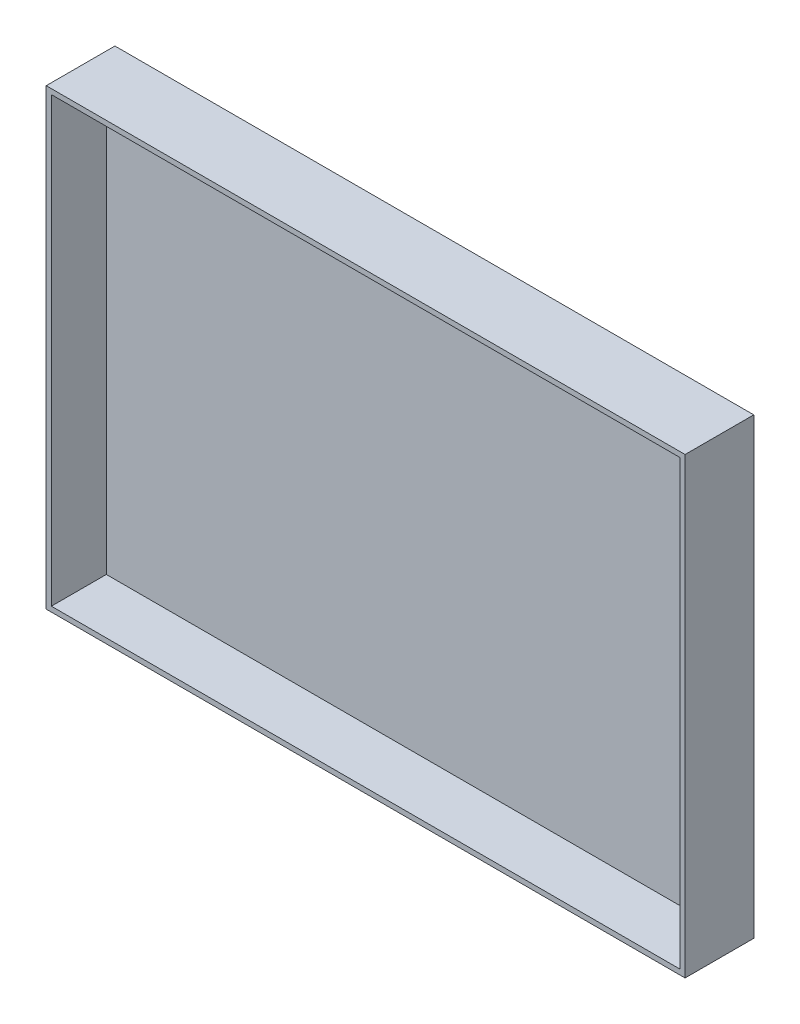
ISO-10303-21;
HEADER;
FILE_DESCRIPTION(('STEP AP214'),'2;1');
FILE_NAME('part.step','',(''),(''),'','','');
FILE_SCHEMA(('AUTOMOTIVE_DESIGN { 1 0 10303 214 1 1 1 1 }'));
ENDSEC;
DATA;
#1=APPLICATION_CONTEXT('core data for automotive mechanical design processes');
#2=APPLICATION_PROTOCOL_DEFINITION('international standard','automotive_design',2000,#1);
#3=PRODUCT_CONTEXT('',#1,'mechanical');
#4=PRODUCT('Part','Part','',(#3));
#5=PRODUCT_RELATED_PRODUCT_CATEGORY('part','',(#4));
#6=PRODUCT_DEFINITION_FORMATION('','',#4);
#7=PRODUCT_DEFINITION_CONTEXT('part definition',#1,'design');
#8=PRODUCT_DEFINITION('design','',#6,#7);
#9=PRODUCT_DEFINITION_SHAPE('','',#8);
#10=(LENGTH_UNIT() NAMED_UNIT(*) SI_UNIT(.MILLI.,.METRE.));
#11=(NAMED_UNIT(*) PLANE_ANGLE_UNIT() SI_UNIT($,.RADIAN.));
#12=(NAMED_UNIT(*) SI_UNIT($,.STERADIAN.) SOLID_ANGLE_UNIT());
#13=UNCERTAINTY_MEASURE_WITH_UNIT(LENGTH_MEASURE(1.E-05),#10,'distance_accuracy_value','');
#14=(GEOMETRIC_REPRESENTATION_CONTEXT(3) GLOBAL_UNCERTAINTY_ASSIGNED_CONTEXT((#13)) GLOBAL_UNIT_ASSIGNED_CONTEXT((#10,
#11,#12)) REPRESENTATION_CONTEXT('',''));
#15=CARTESIAN_POINT('',(0.,0.,0.));
#16=DIRECTION('',(0.,0.,1.));
#17=DIRECTION('',(1.,0.,0.));
#18=AXIS2_PLACEMENT_3D('',#15,#16,#17);
#19=CARTESIAN_POINT('',(45.75,-32.25,10.));
#20=DIRECTION('',(-1.,0.,0.));
#21=DIRECTION('',(0.,0.,1.));
#22=AXIS2_PLACEMENT_3D('',#19,#20,#21);
#23=PLANE('',#22);
#24=DIRECTION('',(0.,0.,-1.));
#25=VECTOR('',#24,1.);
#26=CARTESIAN_POINT('',(45.75,32.25,10.));
#27=LINE('',#26,#25);
#28=CARTESIAN_POINT('',(45.75,32.25,10.));
#29=VERTEX_POINT('',#28);
#30=CARTESIAN_POINT('',(45.75,32.25,2.));
#31=VERTEX_POINT('',#30);
#32=EDGE_CURVE('E112',#29,#31,#27,.T.);
#33=ORIENTED_EDGE('',*,*,#32,.T.);
#34=DIRECTION('',(0.,-1.,0.));
#35=VECTOR('',#34,1.);
#36=CARTESIAN_POINT('',(45.75,-32.25,2.));
#37=LINE('',#36,#35);
#38=CARTESIAN_POINT('',(45.75,-32.25,2.));
#39=VERTEX_POINT('',#38);
#40=EDGE_CURVE('E103',#31,#39,#37,.T.);
#41=ORIENTED_EDGE('',*,*,#40,.T.);
#42=DIRECTION('',(0.,0.,-1.));
#43=VECTOR('',#42,1.);
#44=CARTESIAN_POINT('',(45.75,-32.25,10.));
#45=LINE('',#44,#43);
#46=CARTESIAN_POINT('',(45.75,-32.25,10.));
#47=VERTEX_POINT('',#46);
#48=EDGE_CURVE('E109',#47,#39,#45,.T.);
#49=ORIENTED_EDGE('',*,*,#48,.F.);
#50=DIRECTION('',(0.,1.,0.));
#51=VECTOR('',#50,1.);
#52=CARTESIAN_POINT('',(45.75,-32.25,10.));
#53=LINE('',#52,#51);
#54=EDGE_CURVE('E114',#47,#29,#53,.T.);
#55=ORIENTED_EDGE('',*,*,#54,.T.);
#56=EDGE_LOOP('',(#33,#41,#49,#55));
#57=FACE_BOUND('',#56,.T.);
#58=ADVANCED_FACE('F39',(#57),#23,.T.);
#59=CARTESIAN_POINT('',(-45.75,32.25,10.));
#60=DIRECTION('',(0.,-1.,0.));
#61=DIRECTION('',(0.,0.,-1.));
#62=AXIS2_PLACEMENT_3D('',#59,#60,#61);
#63=PLANE('',#62);
#64=DIRECTION('',(0.,0.,-1.));
#65=VECTOR('',#64,1.);
#66=CARTESIAN_POINT('',(-45.75,32.25,10.));
#67=LINE('',#66,#65);
#68=CARTESIAN_POINT('',(-45.75,32.25,10.));
#69=VERTEX_POINT('',#68);
#70=CARTESIAN_POINT('',(-45.75,32.25,2.));
#71=VERTEX_POINT('',#70);
#72=EDGE_CURVE('E124',#69,#71,#67,.T.);
#73=ORIENTED_EDGE('',*,*,#72,.T.);
#74=DIRECTION('',(1.,0.,0.));
#75=VECTOR('',#74,1.);
#76=CARTESIAN_POINT('',(-45.75,32.25,2.));
#77=LINE('',#76,#75);
#78=EDGE_CURVE('E115',#71,#31,#77,.T.);
#79=ORIENTED_EDGE('',*,*,#78,.T.);
#80=ORIENTED_EDGE('',*,*,#32,.F.);
#81=DIRECTION('',(-1.,0.,0.));
#82=VECTOR('',#81,1.);
#83=CARTESIAN_POINT('',(-45.75,32.25,10.));
#84=LINE('',#83,#82);
#85=EDGE_CURVE('E200',#29,#69,#84,.T.);
#86=ORIENTED_EDGE('',*,*,#85,.T.);
#87=EDGE_LOOP('',(#73,#79,#80,#86));
#88=FACE_BOUND('',#87,.T.);
#89=ADVANCED_FACE('F214',(#88),#63,.T.);
#90=CARTESIAN_POINT('',(-45.75,-32.25,10.));
#91=DIRECTION('',(1.,0.,0.));
#92=DIRECTION('',(0.,0.,-1.));
#93=AXIS2_PLACEMENT_3D('',#90,#91,#92);
#94=PLANE('',#93);
#95=DIRECTION('',(0.,0.,-1.));
#96=VECTOR('',#95,1.);
#97=CARTESIAN_POINT('',(-45.75,-32.25,10.));
#98=LINE('',#97,#96);
#99=CARTESIAN_POINT('',(-45.75,-32.25,10.));
#100=VERTEX_POINT('',#99);
#101=CARTESIAN_POINT('',(-45.75,-32.25,2.));
#102=VERTEX_POINT('',#101);
#103=EDGE_CURVE('E61',#100,#102,#98,.T.);
#104=ORIENTED_EDGE('',*,*,#103,.T.);
#105=DIRECTION('',(0.,1.,0.));
#106=VECTOR('',#105,1.);
#107=CARTESIAN_POINT('',(-45.75,-32.25,2.));
#108=LINE('',#107,#106);
#109=EDGE_CURVE('E55',#102,#71,#108,.T.);
#110=ORIENTED_EDGE('',*,*,#109,.T.);
#111=ORIENTED_EDGE('',*,*,#72,.F.);
#112=DIRECTION('',(0.,-1.,0.));
#113=VECTOR('',#112,1.);
#114=CARTESIAN_POINT('',(-45.75,-32.25,10.));
#115=LINE('',#114,#113);
#116=EDGE_CURVE('E126',#69,#100,#115,.T.);
#117=ORIENTED_EDGE('',*,*,#116,.T.);
#118=EDGE_LOOP('',(#104,#110,#111,#117));
#119=FACE_BOUND('',#118,.T.);
#120=ADVANCED_FACE('F213',(#119),#94,.T.);
#121=CARTESIAN_POINT('',(-45.75,-32.25,10.));
#122=DIRECTION('',(0.,1.,0.));
#123=DIRECTION('',(0.,0.,1.));
#124=AXIS2_PLACEMENT_3D('',#121,#122,#123);
#125=PLANE('',#124);
#126=ORIENTED_EDGE('',*,*,#48,.T.);
#127=DIRECTION('',(-1.,0.,0.));
#128=VECTOR('',#127,1.);
#129=CARTESIAN_POINT('',(-45.75,-32.25,2.));
#130=LINE('',#129,#128);
#131=EDGE_CURVE('E11',#39,#102,#130,.T.);
#132=ORIENTED_EDGE('',*,*,#131,.T.);
#133=ORIENTED_EDGE('',*,*,#103,.F.);
#134=DIRECTION('',(1.,0.,0.));
#135=VECTOR('',#134,1.);
#136=CARTESIAN_POINT('',(-45.75,-32.25,10.));
#137=LINE('',#136,#135);
#138=EDGE_CURVE('E119',#100,#47,#137,.T.);
#139=ORIENTED_EDGE('',*,*,#138,.T.);
#140=EDGE_LOOP('',(#126,#132,#133,#139));
#141=FACE_BOUND('',#140,.T.);
#142=ADVANCED_FACE('F117',(#141),#125,.T.);
#143=CARTESIAN_POINT('',(0.,0.,10.));
#144=DIRECTION('',(0.,0.,1.));
#145=DIRECTION('',(1.,0.,0.));
#146=AXIS2_PLACEMENT_3D('',#143,#144,#145);
#147=PLANE('',#146);
#148=DIRECTION('',(0.,-1.,0.));
#149=VECTOR('',#148,1.);
#150=CARTESIAN_POINT('',(-46.5,-33.,10.));
#151=LINE('',#150,#149);
#152=CARTESIAN_POINT('',(-46.5,33.,10.));
#153=VERTEX_POINT('',#152);
#154=CARTESIAN_POINT('',(-46.5,-33.,10.));
#155=VERTEX_POINT('',#154);
#156=EDGE_CURVE('E136',#153,#155,#151,.T.);
#157=ORIENTED_EDGE('',*,*,#156,.T.);
#158=DIRECTION('',(1.,0.,0.));
#159=VECTOR('',#158,1.);
#160=CARTESIAN_POINT('',(46.5,-33.,10.));
#161=LINE('',#160,#159);
#162=CARTESIAN_POINT('',(46.5,-33.,10.));
#163=VERTEX_POINT('',#162);
#164=EDGE_CURVE('E140',#155,#163,#161,.T.);
#165=ORIENTED_EDGE('',*,*,#164,.T.);
#166=DIRECTION('',(0.,1.,0.));
#167=VECTOR('',#166,1.);
#168=CARTESIAN_POINT('',(46.5,-33.,10.));
#169=LINE('',#168,#167);
#170=CARTESIAN_POINT('',(46.5,33.,10.));
#171=VERTEX_POINT('',#170);
#172=EDGE_CURVE('E144',#163,#171,#169,.T.);
#173=ORIENTED_EDGE('',*,*,#172,.T.);
#174=DIRECTION('',(-1.,0.,0.));
#175=VECTOR('',#174,1.);
#176=CARTESIAN_POINT('',(46.5,33.,10.));
#177=LINE('',#176,#175);
#178=EDGE_CURVE('E147',#171,#153,#177,.T.);
#179=ORIENTED_EDGE('',*,*,#178,.T.);
#180=EDGE_LOOP('',(#157,#165,#173,#179));
#181=FACE_BOUND('',#180,.T.);
#182=ORIENTED_EDGE('',*,*,#85,.F.);
#183=ORIENTED_EDGE('',*,*,#54,.F.);
#184=ORIENTED_EDGE('',*,*,#138,.F.);
#185=ORIENTED_EDGE('',*,*,#116,.F.);
#186=EDGE_LOOP('',(#182,#183,#184,#185));
#187=FACE_BOUND('',#186,.T.);
#188=ADVANCED_FACE('F194',(#181,#187),#147,.T.);
#189=CARTESIAN_POINT('',(0.,0.,0.));
#190=DIRECTION('',(0.,0.,1.));
#191=DIRECTION('',(1.,0.,0.));
#192=AXIS2_PLACEMENT_3D('',#189,#190,#191);
#193=PLANE('',#192);
#194=DIRECTION('',(0.,-1.,0.));
#195=VECTOR('',#194,1.);
#196=CARTESIAN_POINT('',(-46.5,-33.,0.));
#197=LINE('',#196,#195);
#198=CARTESIAN_POINT('',(-46.5,33.,0.));
#199=VERTEX_POINT('',#198);
#200=CARTESIAN_POINT('',(-46.5,-33.,0.));
#201=VERTEX_POINT('',#200);
#202=EDGE_CURVE('E135',#199,#201,#197,.T.);
#203=ORIENTED_EDGE('',*,*,#202,.F.);
#204=DIRECTION('',(-1.,0.,0.));
#205=VECTOR('',#204,1.);
#206=CARTESIAN_POINT('',(46.5,33.,0.));
#207=LINE('',#206,#205);
#208=CARTESIAN_POINT('',(46.5,33.,0.));
#209=VERTEX_POINT('',#208);
#210=EDGE_CURVE('E141',#209,#199,#207,.T.);
#211=ORIENTED_EDGE('',*,*,#210,.F.);
#212=DIRECTION('',(0.,1.,0.));
#213=VECTOR('',#212,1.);
#214=CARTESIAN_POINT('',(46.5,-33.,0.));
#215=LINE('',#214,#213);
#216=CARTESIAN_POINT('',(46.5,-33.,0.));
#217=VERTEX_POINT('',#216);
#218=EDGE_CURVE('E158',#217,#209,#215,.T.);
#219=ORIENTED_EDGE('',*,*,#218,.F.);
#220=DIRECTION('',(1.,0.,0.));
#221=VECTOR('',#220,1.);
#222=CARTESIAN_POINT('',(46.5,-33.,0.));
#223=LINE('',#222,#221);
#224=EDGE_CURVE('E154',#201,#217,#223,.T.);
#225=ORIENTED_EDGE('',*,*,#224,.F.);
#226=EDGE_LOOP('',(#203,#211,#219,#225));
#227=FACE_BOUND('',#226,.T.);
#228=ADVANCED_FACE('F183',(#227),#193,.F.);
#229=CARTESIAN_POINT('',(-46.5,-33.,10.));
#230=DIRECTION('',(1.,0.,0.));
#231=DIRECTION('',(0.,0.,-1.));
#232=AXIS2_PLACEMENT_3D('',#229,#230,#231);
#233=PLANE('',#232);
#234=ORIENTED_EDGE('',*,*,#202,.T.);
#235=DIRECTION('',(0.,0.,-1.));
#236=VECTOR('',#235,1.);
#237=CARTESIAN_POINT('',(-46.5,-33.,10.));
#238=LINE('',#237,#236);
#239=EDGE_CURVE('E48',#155,#201,#238,.T.);
#240=ORIENTED_EDGE('',*,*,#239,.F.);
#241=ORIENTED_EDGE('',*,*,#156,.F.);
#242=DIRECTION('',(0.,0.,-1.));
#243=VECTOR('',#242,1.);
#244=CARTESIAN_POINT('',(-46.5,33.,10.));
#245=LINE('',#244,#243);
#246=EDGE_CURVE('E150',#153,#199,#245,.T.);
#247=ORIENTED_EDGE('',*,*,#246,.T.);
#248=EDGE_LOOP('',(#234,#240,#241,#247));
#249=FACE_BOUND('',#248,.T.);
#250=ADVANCED_FACE('F41',(#249),#233,.F.);
#251=CARTESIAN_POINT('',(46.5,-33.,10.));
#252=DIRECTION('',(0.,1.,0.));
#253=DIRECTION('',(-1.,0.,0.));
#254=AXIS2_PLACEMENT_3D('',#251,#252,#253);
#255=PLANE('',#254);
#256=ORIENTED_EDGE('',*,*,#224,.T.);
#257=DIRECTION('',(0.,0.,-1.));
#258=VECTOR('',#257,1.);
#259=CARTESIAN_POINT('',(46.5,-33.,10.));
#260=LINE('',#259,#258);
#261=EDGE_CURVE('E170',#163,#217,#260,.T.);
#262=ORIENTED_EDGE('',*,*,#261,.F.);
#263=ORIENTED_EDGE('',*,*,#164,.F.);
#264=ORIENTED_EDGE('',*,*,#239,.T.);
#265=EDGE_LOOP('',(#256,#262,#263,#264));
#266=FACE_BOUND('',#265,.T.);
#267=ADVANCED_FACE('F176',(#266),#255,.F.);
#268=CARTESIAN_POINT('',(46.5,-33.,10.));
#269=DIRECTION('',(-1.,0.,0.));
#270=DIRECTION('',(0.,0.,1.));
#271=AXIS2_PLACEMENT_3D('',#268,#269,#270);
#272=PLANE('',#271);
#273=ORIENTED_EDGE('',*,*,#218,.T.);
#274=DIRECTION('',(0.,0.,-1.));
#275=VECTOR('',#274,1.);
#276=CARTESIAN_POINT('',(46.5,33.,10.));
#277=LINE('',#276,#275);
#278=EDGE_CURVE('E167',#171,#209,#277,.T.);
#279=ORIENTED_EDGE('',*,*,#278,.F.);
#280=ORIENTED_EDGE('',*,*,#172,.F.);
#281=ORIENTED_EDGE('',*,*,#261,.T.);
#282=EDGE_LOOP('',(#273,#279,#280,#281));
#283=FACE_BOUND('',#282,.T.);
#284=ADVANCED_FACE('F192',(#283),#272,.F.);
#285=CARTESIAN_POINT('',(46.5,33.,10.));
#286=DIRECTION('',(0.,-1.,0.));
#287=DIRECTION('',(1.,0.,0.));
#288=AXIS2_PLACEMENT_3D('',#285,#286,#287);
#289=PLANE('',#288);
#290=ORIENTED_EDGE('',*,*,#210,.T.);
#291=ORIENTED_EDGE('',*,*,#246,.F.);
#292=ORIENTED_EDGE('',*,*,#178,.F.);
#293=ORIENTED_EDGE('',*,*,#278,.T.);
#294=EDGE_LOOP('',(#290,#291,#292,#293));
#295=FACE_BOUND('',#294,.T.);
#296=ADVANCED_FACE('F188',(#295),#289,.F.);
#297=CARTESIAN_POINT('',(0.,0.,2.));
#298=DIRECTION('',(0.,0.,-1.));
#299=DIRECTION('',(-1.,0.,0.));
#300=AXIS2_PLACEMENT_3D('',#297,#298,#299);
#301=PLANE('',#300);
#302=ORIENTED_EDGE('',*,*,#40,.F.);
#303=ORIENTED_EDGE('',*,*,#78,.F.);
#304=ORIENTED_EDGE('',*,*,#109,.F.);
#305=ORIENTED_EDGE('',*,*,#131,.F.);
#306=EDGE_LOOP('',(#302,#303,#304,#305));
#307=FACE_BOUND('',#306,.T.);
#308=ADVANCED_FACE('F102',(#307),#301,.F.);
#309=CLOSED_SHELL('',(#58,#89,#120,#142,#188,#228,#250,#267,#284,#296,#308));
#310=MANIFOLD_SOLID_BREP('B2',#309);
#311=ADVANCED_BREP_SHAPE_REPRESENTATION('',(#18,#310),#14);
#312=SHAPE_DEFINITION_REPRESENTATION(#9,#311);
ENDSEC;
END-ISO-10303-21;
